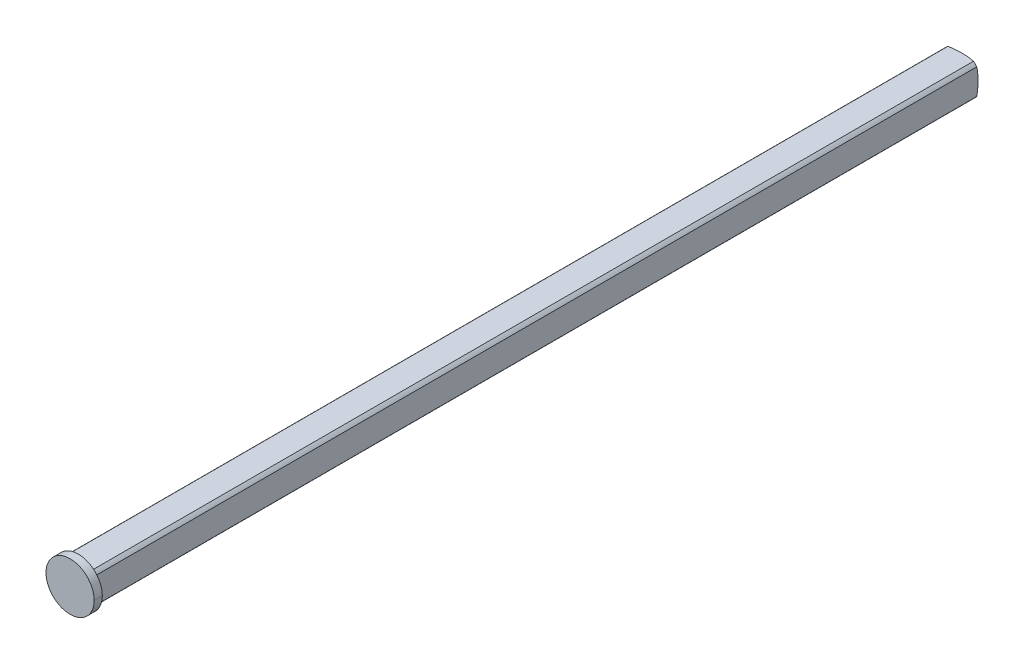
ISO-10303-21;
HEADER;
FILE_DESCRIPTION(('STEP AP214'),'2;1');
FILE_NAME('part.step','',(''),(''),'','','');
FILE_SCHEMA(('AUTOMOTIVE_DESIGN { 1 0 10303 214 1 1 1 1 }'));
ENDSEC;
DATA;
#1=APPLICATION_CONTEXT('core data for automotive mechanical design processes');
#2=APPLICATION_PROTOCOL_DEFINITION('international standard','automotive_design',2000,#1);
#3=PRODUCT_CONTEXT('',#1,'mechanical');
#4=PRODUCT('Part','Part','',(#3));
#5=PRODUCT_RELATED_PRODUCT_CATEGORY('part','',(#4));
#6=PRODUCT_DEFINITION_FORMATION('','',#4);
#7=PRODUCT_DEFINITION_CONTEXT('part definition',#1,'design');
#8=PRODUCT_DEFINITION('design','',#6,#7);
#9=PRODUCT_DEFINITION_SHAPE('','',#8);
#10=(LENGTH_UNIT() NAMED_UNIT(*) SI_UNIT(.MILLI.,.METRE.));
#11=(NAMED_UNIT(*) PLANE_ANGLE_UNIT() SI_UNIT($,.RADIAN.));
#12=(NAMED_UNIT(*) SI_UNIT($,.STERADIAN.) SOLID_ANGLE_UNIT());
#13=UNCERTAINTY_MEASURE_WITH_UNIT(LENGTH_MEASURE(1.E-05),#10,'distance_accuracy_value','');
#14=(GEOMETRIC_REPRESENTATION_CONTEXT(3) GLOBAL_UNCERTAINTY_ASSIGNED_CONTEXT((#13)) GLOBAL_UNIT_ASSIGNED_CONTEXT((#10,
#11,#12)) REPRESENTATION_CONTEXT('',''));
#15=CARTESIAN_POINT('',(0.,0.,0.));
#16=DIRECTION('',(0.,0.,1.));
#17=DIRECTION('',(1.,0.,0.));
#18=AXIS2_PLACEMENT_3D('',#15,#16,#17);
#19=CARTESIAN_POINT('',(0.,0.,0.));
#20=DIRECTION('',(0.,0.,1.));
#21=DIRECTION('',(1.,0.,0.));
#22=AXIS2_PLACEMENT_3D('',#19,#20,#21);
#23=PLANE('',#22);
#24=CARTESIAN_POINT('',(0.,0.,0.));
#25=DIRECTION('',(0.,0.,1.));
#26=DIRECTION('',(1.,0.,0.));
#27=AXIS2_PLACEMENT_3D('',#24,#25,#26);
#28=CIRCLE('',#27,2.375);
#29=CARTESIAN_POINT('',(-2.375,0.,0.));
#30=VERTEX_POINT('',#29);
#31=CARTESIAN_POINT('',(2.375,0.,0.));
#32=VERTEX_POINT('',#31);
#33=EDGE_CURVE('P0_E10',#30,#32,#28,.T.);
#34=ORIENTED_EDGE('',*,*,#33,.F.);
#35=CARTESIAN_POINT('',(0.,0.,0.));
#36=DIRECTION('',(0.,0.,1.));
#37=DIRECTION('',(1.,0.,0.));
#38=AXIS2_PLACEMENT_3D('',#35,#36,#37);
#39=CIRCLE('',#38,2.375);
#40=EDGE_CURVE('P0_E66',#32,#30,#39,.T.);
#41=ORIENTED_EDGE('',*,*,#40,.F.);
#42=EDGE_LOOP('',(#34,#41));
#43=FACE_BOUND('',#42,.T.);
#44=ADVANCED_FACE('P0_F16',(#43),#23,.F.);
#45=CARTESIAN_POINT('',(0.,0.,0.8));
#46=DIRECTION('',(0.,0.,1.));
#47=DIRECTION('',(1.,0.,0.));
#48=AXIS2_PLACEMENT_3D('',#45,#46,#47);
#49=PLANE('',#48);
#50=CARTESIAN_POINT('',(0.,0.,0.8));
#51=DIRECTION('',(0.,0.,1.));
#52=DIRECTION('',(1.,0.,0.));
#53=AXIS2_PLACEMENT_3D('',#50,#51,#52);
#54=CIRCLE('',#53,2.375);
#55=CARTESIAN_POINT('',(-2.375,0.,0.8));
#56=VERTEX_POINT('',#55);
#57=CARTESIAN_POINT('',(2.375,0.,0.8));
#58=VERTEX_POINT('',#57);
#59=EDGE_CURVE('P0_E25',#56,#58,#54,.T.);
#60=ORIENTED_EDGE('',*,*,#59,.T.);
#61=CARTESIAN_POINT('',(0.,0.,0.8));
#62=DIRECTION('',(0.,0.,1.));
#63=DIRECTION('',(1.,0.,0.));
#64=AXIS2_PLACEMENT_3D('',#61,#62,#63);
#65=CIRCLE('',#64,2.375);
#66=EDGE_CURVE('P0_E55',#58,#56,#65,.T.);
#67=ORIENTED_EDGE('',*,*,#66,.T.);
#68=EDGE_LOOP('',(#60,#67));
#69=FACE_BOUND('',#68,.T.);
#70=ADVANCED_FACE('P0_F18',(#69),#49,.T.);
#71=CARTESIAN_POINT('',(0.,0.,0.8));
#72=DIRECTION('',(0.,0.,-1.));
#73=DIRECTION('',(-1.,0.,0.));
#74=AXIS2_PLACEMENT_3D('',#71,#72,#73);
#75=CYLINDRICAL_SURFACE('',#74,2.375);
#76=DIRECTION('',(0.,0.,-1.));
#77=VECTOR('',#76,1.);
#78=CARTESIAN_POINT('',(2.375,0.,0.8));
#79=LINE('',#78,#77);
#80=EDGE_CURVE('P0_E61',#58,#32,#79,.T.);
#81=ORIENTED_EDGE('',*,*,#80,.F.);
#82=ORIENTED_EDGE('',*,*,#59,.F.);
#83=DIRECTION('',(0.,0.,-1.));
#84=VECTOR('',#83,1.);
#85=CARTESIAN_POINT('',(-2.375,0.,0.8));
#86=LINE('',#85,#84);
#87=EDGE_CURVE('P0_E58',#56,#30,#86,.T.);
#88=ORIENTED_EDGE('',*,*,#87,.T.);
#89=ORIENTED_EDGE('',*,*,#33,.T.);
#90=EDGE_LOOP('',(#81,#82,#88,#89));
#91=FACE_BOUND('',#90,.T.);
#92=ADVANCED_FACE('P0_F62',(#91),#75,.T.);
#93=CARTESIAN_POINT('',(0.,0.,0.8));
#94=DIRECTION('',(0.,0.,-1.));
#95=DIRECTION('',(-1.,0.,0.));
#96=AXIS2_PLACEMENT_3D('',#93,#94,#95);
#97=CYLINDRICAL_SURFACE('',#96,2.375);
#98=ORIENTED_EDGE('',*,*,#66,.F.);
#99=ORIENTED_EDGE('',*,*,#80,.T.);
#100=ORIENTED_EDGE('',*,*,#40,.T.);
#101=ORIENTED_EDGE('',*,*,#87,.F.);
#102=EDGE_LOOP('',(#98,#99,#100,#101));
#103=FACE_BOUND('',#102,.T.);
#104=ADVANCED_FACE('P0_F68',(#103),#97,.T.);
#105=CLOSED_SHELL('',(#44,#70,#92,#104));
#106=MANIFOLD_SOLID_BREP('P0_B1',#105);
#107=CARTESIAN_POINT('',(0.,0.,-87.122));
#108=DIRECTION('',(0.,0.,1.));
#109=DIRECTION('',(1.,0.,0.));
#110=AXIS2_PLACEMENT_3D('',#107,#108,#109);
#111=CYLINDRICAL_SURFACE('',#110,2.032);
#112=DIRECTION('',(0.,0.,-1.));
#113=VECTOR('',#112,1.);
#114=CARTESIAN_POINT('',(1.5875,1.26841150657032,-87.122));
#115=LINE('',#114,#113);
#116=CARTESIAN_POINT('',(1.5875,1.26841150657032,0.));
#117=VERTEX_POINT('',#116);
#118=CARTESIAN_POINT('',(1.5875,1.26841150657032,-86.970919142098));
#119=VERTEX_POINT('',#118);
#120=EDGE_CURVE('P1_E113',#117,#119,#115,.T.);
#121=ORIENTED_EDGE('',*,*,#120,.T.);
#122=CARTESIAN_POINT('',(0.,0.,-86.970919142098));
#123=DIRECTION('',(0.,0.,1.));
#124=DIRECTION('',(1.,0.,0.));
#125=AXIS2_PLACEMENT_3D('',#122,#123,#124);
#126=CIRCLE('',#125,2.032);
#127=CARTESIAN_POINT('',(1.26841150657032,1.5875,-86.970919142098));
#128=VERTEX_POINT('',#127);
#129=EDGE_CURVE('P1_E262',#119,#128,#126,.T.);
#130=ORIENTED_EDGE('',*,*,#129,.T.);
#131=DIRECTION('',(0.,0.,1.));
#132=VECTOR('',#131,1.);
#133=CARTESIAN_POINT('',(1.26841150657032,1.5875,-87.122));
#134=LINE('',#133,#132);
#135=CARTESIAN_POINT('',(1.26841150657032,1.5875,0.));
#136=VERTEX_POINT('',#135);
#137=EDGE_CURVE('P1_E234',#128,#136,#134,.T.);
#138=ORIENTED_EDGE('',*,*,#137,.T.);
#139=CARTESIAN_POINT('',(0.,0.,0.));
#140=DIRECTION('',(0.,0.,1.));
#141=DIRECTION('',(1.,0.,0.));
#142=AXIS2_PLACEMENT_3D('',#139,#140,#141);
#143=CIRCLE('',#142,2.032);
#144=EDGE_CURVE('P1_E444',#117,#136,#143,.T.);
#145=ORIENTED_EDGE('',*,*,#144,.F.);
#146=EDGE_LOOP('',(#121,#130,#138,#145));
#147=FACE_BOUND('',#146,.T.);
#148=ADVANCED_FACE('P1_F17',(#147),#111,.T.);
#149=CARTESIAN_POINT('',(0.,0.,-87.122));
#150=DIRECTION('',(0.,0.,1.));
#151=DIRECTION('',(1.,0.,0.));
#152=AXIS2_PLACEMENT_3D('',#149,#150,#151);
#153=CYLINDRICAL_SURFACE('',#152,2.032);
#154=DIRECTION('',(0.,0.,1.));
#155=VECTOR('',#154,1.);
#156=CARTESIAN_POINT('',(-1.5875,1.26841150657032,-87.122));
#157=LINE('',#156,#155);
#158=CARTESIAN_POINT('',(-1.5875,1.26841150657032,-86.970919142098));
#159=VERTEX_POINT('',#158);
#160=CARTESIAN_POINT('',(-1.5875,1.26841150657032,0.));
#161=VERTEX_POINT('',#160);
#162=EDGE_CURVE('P1_E174',#159,#161,#157,.T.);
#163=ORIENTED_EDGE('',*,*,#162,.T.);
#164=CARTESIAN_POINT('',(0.,0.,0.));
#165=DIRECTION('',(0.,0.,1.));
#166=DIRECTION('',(1.,0.,0.));
#167=AXIS2_PLACEMENT_3D('',#164,#165,#166);
#168=CIRCLE('',#167,2.032);
#169=CARTESIAN_POINT('',(-1.26841150657032,1.5875,0.));
#170=VERTEX_POINT('',#169);
#171=EDGE_CURVE('P1_E43',#170,#161,#168,.T.);
#172=ORIENTED_EDGE('',*,*,#171,.F.);
#173=DIRECTION('',(0.,0.,-1.));
#174=VECTOR('',#173,1.);
#175=CARTESIAN_POINT('',(-1.26841150657032,1.5875,-87.122));
#176=LINE('',#175,#174);
#177=CARTESIAN_POINT('',(-1.26841150657032,1.5875,-86.970919142098));
#178=VERTEX_POINT('',#177);
#179=EDGE_CURVE('P1_E243',#170,#178,#176,.T.);
#180=ORIENTED_EDGE('',*,*,#179,.T.);
#181=CARTESIAN_POINT('',(0.,0.,-86.970919142098));
#182=DIRECTION('',(0.,0.,1.));
#183=DIRECTION('',(1.,0.,0.));
#184=AXIS2_PLACEMENT_3D('',#181,#182,#183);
#185=CIRCLE('',#184,2.032);
#186=EDGE_CURVE('P1_E252',#178,#159,#185,.T.);
#187=ORIENTED_EDGE('',*,*,#186,.T.);
#188=EDGE_LOOP('',(#163,#172,#180,#187));
#189=FACE_BOUND('',#188,.T.);
#190=ADVANCED_FACE('P1_F19',(#189),#153,.T.);
#191=CARTESIAN_POINT('',(0.,0.,-87.122));
#192=DIRECTION('',(0.,0.,1.));
#193=DIRECTION('',(1.,0.,0.));
#194=AXIS2_PLACEMENT_3D('',#191,#192,#193);
#195=CYLINDRICAL_SURFACE('',#194,2.032);
#196=DIRECTION('',(0.,0.,-1.));
#197=VECTOR('',#196,1.);
#198=CARTESIAN_POINT('',(-1.5875,-1.26841150657032,-87.122));
#199=LINE('',#198,#197);
#200=CARTESIAN_POINT('',(-1.5875,-1.26841150657032,0.));
#201=VERTEX_POINT('',#200);
#202=CARTESIAN_POINT('',(-1.5875,-1.26841150657032,-86.970919142098));
#203=VERTEX_POINT('',#202);
#204=EDGE_CURVE('P1_E160',#201,#203,#199,.T.);
#205=ORIENTED_EDGE('',*,*,#204,.T.);
#206=CARTESIAN_POINT('',(0.,0.,-86.970919142098));
#207=DIRECTION('',(0.,0.,1.));
#208=DIRECTION('',(1.,0.,0.));
#209=AXIS2_PLACEMENT_3D('',#206,#207,#208);
#210=CIRCLE('',#209,2.032);
#211=CARTESIAN_POINT('',(-1.26841150657032,-1.5875,-86.970919142098));
#212=VERTEX_POINT('',#211);
#213=EDGE_CURVE('P1_E11',#203,#212,#210,.T.);
#214=ORIENTED_EDGE('',*,*,#213,.T.);
#215=DIRECTION('',(0.,0.,1.));
#216=VECTOR('',#215,1.);
#217=CARTESIAN_POINT('',(-1.26841150657032,-1.5875,-87.122));
#218=LINE('',#217,#216);
#219=CARTESIAN_POINT('',(-1.26841150657032,-1.5875,0.));
#220=VERTEX_POINT('',#219);
#221=EDGE_CURVE('P1_E344',#212,#220,#218,.T.);
#222=ORIENTED_EDGE('',*,*,#221,.T.);
#223=CARTESIAN_POINT('',(0.,0.,0.));
#224=DIRECTION('',(0.,0.,1.));
#225=DIRECTION('',(1.,0.,0.));
#226=AXIS2_PLACEMENT_3D('',#223,#224,#225);
#227=CIRCLE('',#226,2.032);
#228=EDGE_CURVE('P1_E145',#201,#220,#227,.T.);
#229=ORIENTED_EDGE('',*,*,#228,.F.);
#230=EDGE_LOOP('',(#205,#214,#222,#229));
#231=FACE_BOUND('',#230,.T.);
#232=ADVANCED_FACE('P1_F161',(#231),#195,.T.);
#233=CARTESIAN_POINT('',(0.,0.,-87.122));
#234=DIRECTION('',(0.,0.,1.));
#235=DIRECTION('',(1.,0.,0.));
#236=AXIS2_PLACEMENT_3D('',#233,#234,#235);
#237=CYLINDRICAL_SURFACE('',#236,2.032);
#238=DIRECTION('',(0.,0.,-1.));
#239=VECTOR('',#238,1.);
#240=CARTESIAN_POINT('',(1.26841150657032,-1.5875,-87.122));
#241=LINE('',#240,#239);
#242=CARTESIAN_POINT('',(1.26841150657032,-1.5875,0.));
#243=VERTEX_POINT('',#242);
#244=CARTESIAN_POINT('',(1.26841150657032,-1.5875,-86.970919142098));
#245=VERTEX_POINT('',#244);
#246=EDGE_CURVE('P1_E348',#243,#245,#241,.T.);
#247=ORIENTED_EDGE('',*,*,#246,.T.);
#248=CARTESIAN_POINT('',(0.,0.,-86.970919142098));
#249=DIRECTION('',(0.,0.,1.));
#250=DIRECTION('',(1.,0.,0.));
#251=AXIS2_PLACEMENT_3D('',#248,#249,#250);
#252=CIRCLE('',#251,2.032);
#253=CARTESIAN_POINT('',(1.5875,-1.26841150657032,-86.970919142098));
#254=VERTEX_POINT('',#253);
#255=EDGE_CURVE('P1_E28',#245,#254,#252,.T.);
#256=ORIENTED_EDGE('',*,*,#255,.T.);
#257=DIRECTION('',(0.,0.,1.));
#258=VECTOR('',#257,1.);
#259=CARTESIAN_POINT('',(1.5875,-1.26841150657032,-87.122));
#260=LINE('',#259,#258);
#261=CARTESIAN_POINT('',(1.5875,-1.26841150657032,0.));
#262=VERTEX_POINT('',#261);
#263=EDGE_CURVE('P1_E358',#254,#262,#260,.T.);
#264=ORIENTED_EDGE('',*,*,#263,.T.);
#265=CARTESIAN_POINT('',(0.,0.,0.));
#266=DIRECTION('',(0.,0.,1.));
#267=DIRECTION('',(1.,0.,0.));
#268=AXIS2_PLACEMENT_3D('',#265,#266,#267);
#269=CIRCLE('',#268,2.032);
#270=EDGE_CURVE('P1_E446',#243,#262,#269,.T.);
#271=ORIENTED_EDGE('',*,*,#270,.F.);
#272=EDGE_LOOP('',(#247,#256,#264,#271));
#273=FACE_BOUND('',#272,.T.);
#274=ADVANCED_FACE('P1_F329',(#273),#237,.T.);
#275=CARTESIAN_POINT('',(-1.5875,1.5875,-87.122));
#276=DIRECTION('',(0.,0.,-1.));
#277=DIRECTION('',(0.,-1.,0.));
#278=AXIS2_PLACEMENT_3D('',#275,#276,#277);
#279=PLANE('',#278);
#280=CARTESIAN_POINT('',(0.,0.,-87.122));
#281=DIRECTION('',(0.,0.,1.));
#282=DIRECTION('',(1.,0.,0.));
#283=AXIS2_PLACEMENT_3D('',#280,#281,#282);
#284=CIRCLE('',#283,1.24506403026729);
#285=CARTESIAN_POINT('',(1.24506403026729,0.,-87.122));
#286=VERTEX_POINT('',#285);
#287=CARTESIAN_POINT('',(-1.24506403026729,0.,-87.122));
#288=VERTEX_POINT('',#287);
#289=EDGE_CURVE('P1_E269',#286,#288,#284,.T.);
#290=ORIENTED_EDGE('',*,*,#289,.F.);
#291=CARTESIAN_POINT('',(0.,0.,-87.122));
#292=DIRECTION('',(0.,0.,1.));
#293=DIRECTION('',(1.,0.,0.));
#294=AXIS2_PLACEMENT_3D('',#291,#292,#293);
#295=CIRCLE('',#294,1.24506403026729);
#296=EDGE_CURVE('P1_E62',#288,#286,#295,.T.);
#297=ORIENTED_EDGE('',*,*,#296,.F.);
#298=EDGE_LOOP('',(#290,#297));
#299=FACE_BOUND('',#298,.T.);
#300=ADVANCED_FACE('P1_F328',(#299),#279,.T.);
#301=CARTESIAN_POINT('',(0.,0.,-84.997));
#302=DIRECTION('',(0.,0.,1.));
#303=DIRECTION('',(1.,0.,0.));
#304=AXIS2_PLACEMENT_3D('',#301,#302,#303);
#305=DEGENERATE_TOROIDAL_SURFACE('',#304,1.24506403026729,2.125,.T.);
#306=CARTESIAN_POINT('',(-1.24506403026729,0.,-84.997));
#307=DIRECTION('',(0.,1.,0.));
#308=DIRECTION('',(-1.,0.,0.));
#309=AXIS2_PLACEMENT_3D('',#306,#307,#308);
#310=CIRCLE('',#309,2.125);
#311=CARTESIAN_POINT('',(-1.5875,0.,-87.0942273616929));
#312=VERTEX_POINT('',#311);
#313=EDGE_CURVE('P1_E264',#288,#312,#310,.T.);
#314=ORIENTED_EDGE('',*,*,#313,.F.);
#315=ORIENTED_EDGE('',*,*,#296,.T.);
#316=CARTESIAN_POINT('',(1.24506403026729,0.,-84.997));
#317=DIRECTION('',(0.,-1.,0.));
#318=DIRECTION('',(0.,0.,-1.));
#319=AXIS2_PLACEMENT_3D('',#316,#317,#318);
#320=CIRCLE('',#319,2.125);
#321=CARTESIAN_POINT('',(1.5875,0.,-87.0942273616929));
#322=VERTEX_POINT('',#321);
#323=EDGE_CURVE('P1_E375',#286,#322,#320,.T.);
#324=ORIENTED_EDGE('',*,*,#323,.T.);
#325=CARTESIAN_POINT('',(1.5875,-1.26841150657032,-86.970919142098));
#326=CARTESIAN_POINT('',(1.5875,-0.987077094955604,-87.0409306391242));
#327=CARTESIAN_POINT('',(1.5875,-0.639530459017568,-87.0701819538896));
#328=CARTESIAN_POINT('',(1.5875,-0.353837297571992,-87.0942273616929));
#329=CARTESIAN_POINT('',(1.5875,0.,-87.0942273616929));
#330=B_SPLINE_CURVE_WITH_KNOTS('',2,(#325,#326,#327,#328,#329),.UNSPECIFIED.,.F.,.F.,(3,2,3),
(0.,0.5,1.),.UNSPECIFIED.);
#331=EDGE_CURVE('P1_E102',#254,#322,#330,.T.);
#332=ORIENTED_EDGE('',*,*,#331,.F.);
#333=ORIENTED_EDGE('',*,*,#255,.F.);
#334=CARTESIAN_POINT('',(-1.26841150657032,-1.5875,-86.970919142098));
#335=CARTESIAN_POINT('',(-0.770338232158669,-1.5875,-87.0948672057926));
#336=CARTESIAN_POINT('',(0.00849337593367507,-1.5875,-87.0942236517902));
#337=CARTESIAN_POINT('',(0.775470990450085,-1.5875,-87.0935898928256));
#338=CARTESIAN_POINT('',(1.26841150657033,-1.5875,-86.970919142098));
#339=B_SPLINE_CURVE_WITH_KNOTS('',2,(#334,#335,#336,#337,#338),.UNSPECIFIED.,.F.,.F.,(3,2,3),
(0.,0.5,1.),.UNSPECIFIED.);
#340=EDGE_CURVE('P1_E156',#212,#245,#339,.T.);
#341=ORIENTED_EDGE('',*,*,#340,.F.);
#342=ORIENTED_EDGE('',*,*,#213,.F.);
#343=CARTESIAN_POINT('',(-1.5875,0.,-87.0942273616929));
#344=CARTESIAN_POINT('',(-1.5875,-0.353179957327024,-87.0942273616929));
#345=CARTESIAN_POINT('',(-1.5875,-0.639529322286498,-87.0701820494506));
#346=CARTESIAN_POINT('',(-1.5875,-0.986669843198658,-87.0410319857917));
#347=CARTESIAN_POINT('',(-1.5875,-1.26841150657032,-86.970919142098));
#348=B_SPLINE_CURVE_WITH_KNOTS('',2,(#343,#344,#345,#346,#347),.UNSPECIFIED.,.F.,.F.,(3,2,3),
(0.,0.5,1.),.UNSPECIFIED.);
#349=EDGE_CURVE('P1_E152',#312,#203,#348,.T.);
#350=ORIENTED_EDGE('',*,*,#349,.F.);
#351=EDGE_LOOP('',(#314,#315,#324,#332,#333,#341,#342,#350));
#352=FACE_BOUND('',#351,.T.);
#353=ADVANCED_FACE('P1_F150',(#352),#305,.T.);
#354=CARTESIAN_POINT('',(-1.5875,1.5875,0.));
#355=DIRECTION('',(0.,0.,-1.));
#356=DIRECTION('',(0.,-1.,0.));
#357=AXIS2_PLACEMENT_3D('',#354,#355,#356);
#358=PLANE('',#357);
#359=ORIENTED_EDGE('',*,*,#171,.T.);
#360=DIRECTION('',(0.,-1.,0.));
#361=VECTOR('',#360,1.);
#362=CARTESIAN_POINT('',(-1.5875,-1.5875,0.));
#363=LINE('',#362,#361);
#364=EDGE_CURVE('P1_E165',#161,#201,#363,.T.);
#365=ORIENTED_EDGE('',*,*,#364,.T.);
#366=ORIENTED_EDGE('',*,*,#228,.T.);
#367=DIRECTION('',(1.,0.,0.));
#368=VECTOR('',#367,1.);
#369=CARTESIAN_POINT('',(-1.5875,-1.5875,0.));
#370=LINE('',#369,#368);
#371=EDGE_CURVE('P1_E350',#220,#243,#370,.T.);
#372=ORIENTED_EDGE('',*,*,#371,.T.);
#373=ORIENTED_EDGE('',*,*,#270,.T.);
#374=DIRECTION('',(0.,1.,0.));
#375=VECTOR('',#374,1.);
#376=CARTESIAN_POINT('',(1.5875,-1.5875,0.));
#377=LINE('',#376,#375);
#378=EDGE_CURVE('P1_E244',#262,#117,#377,.T.);
#379=ORIENTED_EDGE('',*,*,#378,.T.);
#380=ORIENTED_EDGE('',*,*,#144,.T.);
#381=DIRECTION('',(-1.,0.,0.));
#382=VECTOR('',#381,1.);
#383=CARTESIAN_POINT('',(-1.5875,1.5875,0.));
#384=LINE('',#383,#382);
#385=EDGE_CURVE('P1_E249',#136,#170,#384,.T.);
#386=ORIENTED_EDGE('',*,*,#385,.T.);
#387=EDGE_LOOP('',(#359,#365,#366,#372,#373,#379,#380,#386));
#388=FACE_BOUND('',#387,.T.);
#389=ADVANCED_FACE('P1_F303',(#388),#358,.F.);
#390=CARTESIAN_POINT('',(-1.5875,1.5875,0.));
#391=DIRECTION('',(0.,-1.,0.));
#392=DIRECTION('',(0.,0.,-1.));
#393=AXIS2_PLACEMENT_3D('',#390,#391,#392);
#394=PLANE('',#393);
#395=ORIENTED_EDGE('',*,*,#137,.F.);
#396=CARTESIAN_POINT('',(1.26841150657033,1.5875,-86.970919142098));
#397=CARTESIAN_POINT('',(0.77033823215867,1.5875,-87.0948672057926));
#398=CARTESIAN_POINT('',(-0.00849337593367486,1.5875,-87.0942236517902));
#399=CARTESIAN_POINT('',(-0.775470990450082,1.5875,-87.0935898928256));
#400=CARTESIAN_POINT('',(-1.26841150657032,1.5875,-86.970919142098));
#401=B_SPLINE_CURVE_WITH_KNOTS('',2,(#396,#397,#398,#399,#400),.UNSPECIFIED.,.F.,.F.,(3,2,3),
(0.,0.5,1.),.UNSPECIFIED.);
#402=EDGE_CURVE('P1_E255',#128,#178,#401,.T.);
#403=ORIENTED_EDGE('',*,*,#402,.T.);
#404=ORIENTED_EDGE('',*,*,#179,.F.);
#405=ORIENTED_EDGE('',*,*,#385,.F.);
#406=EDGE_LOOP('',(#395,#403,#404,#405));
#407=FACE_BOUND('',#406,.T.);
#408=ADVANCED_FACE('P1_F301',(#407),#394,.F.);
#409=CARTESIAN_POINT('',(1.5875,-1.5875,0.));
#410=DIRECTION('',(-1.,0.,0.));
#411=DIRECTION('',(0.,0.,1.));
#412=AXIS2_PLACEMENT_3D('',#409,#410,#411);
#413=PLANE('',#412);
#414=ORIENTED_EDGE('',*,*,#263,.F.);
#415=ORIENTED_EDGE('',*,*,#331,.T.);
#416=CARTESIAN_POINT('',(1.5875,0.,-87.0942273616929));
#417=CARTESIAN_POINT('',(1.5875,0.35317995732708,-87.0942273616929));
#418=CARTESIAN_POINT('',(1.5875,0.6395293222865,-87.0701820494506));
#419=CARTESIAN_POINT('',(1.5875,0.986669843198695,-87.0410319857917));
#420=CARTESIAN_POINT('',(1.5875,1.26841150657033,-86.970919142098));
#421=B_SPLINE_CURVE_WITH_KNOTS('',2,(#416,#417,#418,#419,#420),.UNSPECIFIED.,.F.,.F.,(3,2,3),
(0.,0.5,1.),.UNSPECIFIED.);
#422=EDGE_CURVE('P1_E286',#322,#119,#421,.T.);
#423=ORIENTED_EDGE('',*,*,#422,.T.);
#424=ORIENTED_EDGE('',*,*,#120,.F.);
#425=ORIENTED_EDGE('',*,*,#378,.F.);
#426=EDGE_LOOP('',(#414,#415,#423,#424,#425));
#427=FACE_BOUND('',#426,.T.);
#428=ADVANCED_FACE('P1_F291',(#427),#413,.F.);
#429=CARTESIAN_POINT('',(-1.5875,-1.5875,0.));
#430=DIRECTION('',(0.,1.,0.));
#431=DIRECTION('',(1.,0.,0.));
#432=AXIS2_PLACEMENT_3D('',#429,#430,#431);
#433=PLANE('',#432);
#434=ORIENTED_EDGE('',*,*,#221,.F.);
#435=ORIENTED_EDGE('',*,*,#340,.T.);
#436=ORIENTED_EDGE('',*,*,#246,.F.);
#437=ORIENTED_EDGE('',*,*,#371,.F.);
#438=EDGE_LOOP('',(#434,#435,#436,#437));
#439=FACE_BOUND('',#438,.T.);
#440=ADVANCED_FACE('P1_F192',(#439),#433,.F.);
#441=CARTESIAN_POINT('',(-1.5875,-1.5875,0.));
#442=DIRECTION('',(1.,0.,0.));
#443=DIRECTION('',(0.,1.,0.));
#444=AXIS2_PLACEMENT_3D('',#441,#442,#443);
#445=PLANE('',#444);
#446=ORIENTED_EDGE('',*,*,#162,.F.);
#447=CARTESIAN_POINT('',(-1.5875,1.26841150657033,-86.970919142098));
#448=CARTESIAN_POINT('',(-1.5875,0.987077094955625,-87.0409306391242));
#449=CARTESIAN_POINT('',(-1.5875,0.63953045901757,-87.0701819538896));
#450=CARTESIAN_POINT('',(-1.5875,0.35383729757202,-87.0942273616929));
#451=CARTESIAN_POINT('',(-1.5875,0.,-87.0942273616929));
#452=B_SPLINE_CURVE_WITH_KNOTS('',2,(#447,#448,#449,#450,#451),.UNSPECIFIED.,.F.,.F.,(3,2,3),
(0.,0.5,1.),.UNSPECIFIED.);
#453=EDGE_CURVE('P1_E170',#159,#312,#452,.T.);
#454=ORIENTED_EDGE('',*,*,#453,.T.);
#455=ORIENTED_EDGE('',*,*,#349,.T.);
#456=ORIENTED_EDGE('',*,*,#204,.F.);
#457=ORIENTED_EDGE('',*,*,#364,.F.);
#458=EDGE_LOOP('',(#446,#454,#455,#456,#457));
#459=FACE_BOUND('',#458,.T.);
#460=ADVANCED_FACE('P1_F168',(#459),#445,.F.);
#461=CARTESIAN_POINT('',(0.,0.,-84.997));
#462=DIRECTION('',(0.,0.,1.));
#463=DIRECTION('',(1.,0.,0.));
#464=AXIS2_PLACEMENT_3D('',#461,#462,#463);
#465=DEGENERATE_TOROIDAL_SURFACE('',#464,1.24506403026729,2.125,.T.);
#466=ORIENTED_EDGE('',*,*,#289,.T.);
#467=ORIENTED_EDGE('',*,*,#313,.T.);
#468=ORIENTED_EDGE('',*,*,#453,.F.);
#469=ORIENTED_EDGE('',*,*,#186,.F.);
#470=ORIENTED_EDGE('',*,*,#402,.F.);
#471=ORIENTED_EDGE('',*,*,#129,.F.);
#472=ORIENTED_EDGE('',*,*,#422,.F.);
#473=ORIENTED_EDGE('',*,*,#323,.F.);
#474=EDGE_LOOP('',(#466,#467,#468,#469,#470,#471,#472,#473));
#475=FACE_BOUND('',#474,.T.);
#476=ADVANCED_FACE('P1_F191',(#475),#465,.T.);
#477=CLOSED_SHELL('',(#148,#190,#232,#274,#300,#353,#389,#408,#428,#440,#460,#476));
#478=MANIFOLD_SOLID_BREP('P1_B1',#477);
#479=ADVANCED_BREP_SHAPE_REPRESENTATION('',(#18,#106,#478),#14);
#480=SHAPE_DEFINITION_REPRESENTATION(#9,#479);
ENDSEC;
END-ISO-10303-21;
